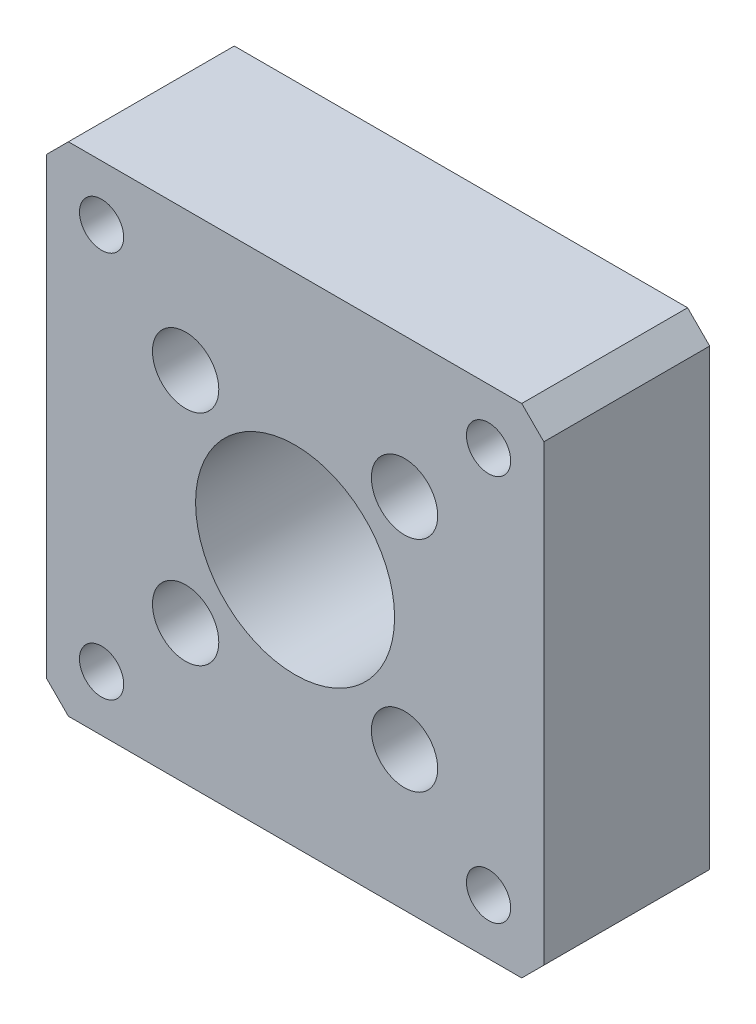
ISO-10303-21;
HEADER;
FILE_DESCRIPTION(('STEP AP214'),'2;1');
FILE_NAME('part.step','',(''),(''),'','','');
FILE_SCHEMA(('AUTOMOTIVE_DESIGN { 1 0 10303 214 1 1 1 1 }'));
ENDSEC;
DATA;
#1=APPLICATION_CONTEXT('core data for automotive mechanical design processes');
#2=APPLICATION_PROTOCOL_DEFINITION('international standard','automotive_design',2000,#1);
#3=PRODUCT_CONTEXT('',#1,'mechanical');
#4=PRODUCT('Part','Part','',(#3));
#5=PRODUCT_RELATED_PRODUCT_CATEGORY('part','',(#4));
#6=PRODUCT_DEFINITION_FORMATION('','',#4);
#7=PRODUCT_DEFINITION_CONTEXT('part definition',#1,'design');
#8=PRODUCT_DEFINITION('design','',#6,#7);
#9=PRODUCT_DEFINITION_SHAPE('','',#8);
#10=(LENGTH_UNIT() NAMED_UNIT(*) SI_UNIT(.MILLI.,.METRE.));
#11=(NAMED_UNIT(*) PLANE_ANGLE_UNIT() SI_UNIT($,.RADIAN.));
#12=(NAMED_UNIT(*) SI_UNIT($,.STERADIAN.) SOLID_ANGLE_UNIT());
#13=UNCERTAINTY_MEASURE_WITH_UNIT(LENGTH_MEASURE(1.E-05),#10,'distance_accuracy_value','');
#14=(GEOMETRIC_REPRESENTATION_CONTEXT(3) GLOBAL_UNCERTAINTY_ASSIGNED_CONTEXT((#13)) GLOBAL_UNIT_ASSIGNED_CONTEXT((#10,
#11,#12)) REPRESENTATION_CONTEXT('',''));
#15=CARTESIAN_POINT('',(0.,0.,0.));
#16=DIRECTION('',(0.,0.,1.));
#17=DIRECTION('',(1.,0.,0.));
#18=AXIS2_PLACEMENT_3D('',#15,#16,#17);
#19=CARTESIAN_POINT('',(0.,0.,11.2418833056655));
#20=DIRECTION('',(0.,0.,-1.));
#21=DIRECTION('',(-1.,0.,0.));
#22=AXIS2_PLACEMENT_3D('',#19,#20,#21);
#23=CYLINDRICAL_SURFACE('',#22,4.5);
#24=CARTESIAN_POINT('',(0.,0.,11.2418833056655));
#25=DIRECTION('',(0.,0.,1.));
#26=DIRECTION('',(1.,0.,0.));
#27=AXIS2_PLACEMENT_3D('',#24,#25,#26);
#28=CIRCLE('',#27,4.5);
#29=CARTESIAN_POINT('',(4.50000000000002,0.,11.2418833056655));
#30=VERTEX_POINT('',#29);
#31=EDGE_CURVE('E186',#30,#30,#28,.T.);
#32=ORIENTED_EDGE('',*,*,#31,.T.);
#33=EDGE_LOOP('',(#32));
#34=FACE_BOUND('',#33,.T.);
#35=CARTESIAN_POINT('',(0.,0.,4.74188330566552));
#36=DIRECTION('',(0.,0.,-1.));
#37=DIRECTION('',(-1.,0.,0.));
#38=AXIS2_PLACEMENT_3D('',#35,#36,#37);
#39=CIRCLE('',#38,4.5);
#40=CARTESIAN_POINT('',(-4.49999999999998,0.,4.74188330566552));
#41=VERTEX_POINT('',#40);
#42=EDGE_CURVE('E43',#41,#41,#39,.T.);
#43=ORIENTED_EDGE('',*,*,#42,.T.);
#44=EDGE_LOOP('',(#43));
#45=FACE_BOUND('',#44,.T.);
#46=ADVANCED_FACE('F39',(#34,#45),#23,.F.);
#47=CARTESIAN_POINT('',(4.94974746830584,4.94974746830584,1.40843092774945));
#48=DIRECTION('',(0.,0.,1.));
#49=DIRECTION('',(1.,0.,0.));
#50=AXIS2_PLACEMENT_3D('',#47,#48,#49);
#51=CYLINDRICAL_SURFACE('',#50,0.825);
#52=CARTESIAN_POINT('',(4.94974746830584,4.94974746830584,3.74188330566552));
#53=DIRECTION('',(0.,0.,1.));
#54=DIRECTION('',(1.,0.,0.));
#55=AXIS2_PLACEMENT_3D('',#52,#53,#54);
#56=CIRCLE('',#55,0.825);
#57=CARTESIAN_POINT('',(5.77474746830584,4.94974746830584,3.74188330566552));
#58=VERTEX_POINT('',#57);
#59=EDGE_CURVE('E218',#58,#58,#56,.F.);
#60=ORIENTED_EDGE('',*,*,#59,.T.);
#61=EDGE_LOOP('',(#60));
#62=FACE_BOUND('',#61,.T.);
#63=CARTESIAN_POINT('',(4.94974746830584,4.94974746830584,7.24188330566553));
#64=DIRECTION('',(0.,0.,1.));
#65=DIRECTION('',(1.,0.,0.));
#66=AXIS2_PLACEMENT_3D('',#63,#64,#65);
#67=CIRCLE('',#66,0.825);
#68=CARTESIAN_POINT('',(5.77474746830584,4.94974746830584,7.24188330566553));
#69=VERTEX_POINT('',#68);
#70=EDGE_CURVE('E152',#69,#69,#67,.F.);
#71=ORIENTED_EDGE('',*,*,#70,.F.);
#72=EDGE_LOOP('',(#71));
#73=FACE_BOUND('',#72,.T.);
#74=ADVANCED_FACE('F275',(#62,#73),#51,.F.);
#75=CARTESIAN_POINT('',(4.94974746830585,-4.94974746830584,1.40843092774945));
#76=DIRECTION('',(0.,0.,1.));
#77=DIRECTION('',(1.,0.,0.));
#78=AXIS2_PLACEMENT_3D('',#75,#76,#77);
#79=CYLINDRICAL_SURFACE('',#78,0.825);
#80=CARTESIAN_POINT('',(4.94974746830585,-4.94974746830584,3.74188330566552));
#81=DIRECTION('',(0.,0.,1.));
#82=DIRECTION('',(1.,0.,0.));
#83=AXIS2_PLACEMENT_3D('',#80,#81,#82);
#84=CIRCLE('',#83,0.825);
#85=CARTESIAN_POINT('',(5.77474746830585,-4.94974746830584,3.74188330566552));
#86=VERTEX_POINT('',#85);
#87=EDGE_CURVE('E223',#86,#86,#84,.F.);
#88=ORIENTED_EDGE('',*,*,#87,.T.);
#89=EDGE_LOOP('',(#88));
#90=FACE_BOUND('',#89,.T.);
#91=CARTESIAN_POINT('',(4.94974746830585,-4.94974746830584,7.24188330566553));
#92=DIRECTION('',(0.,0.,1.));
#93=DIRECTION('',(1.,0.,0.));
#94=AXIS2_PLACEMENT_3D('',#91,#92,#93);
#95=CIRCLE('',#94,0.825);
#96=CARTESIAN_POINT('',(5.77474746830585,-4.94974746830584,7.24188330566553));
#97=VERTEX_POINT('',#96);
#98=EDGE_CURVE('E149',#97,#97,#95,.F.);
#99=ORIENTED_EDGE('',*,*,#98,.F.);
#100=EDGE_LOOP('',(#99));
#101=FACE_BOUND('',#100,.T.);
#102=ADVANCED_FACE('F281',(#90,#101),#79,.F.);
#103=CARTESIAN_POINT('',(-4.94974746830566,-4.94974746830598,1.40843092774945));
#104=DIRECTION('',(0.,0.,1.));
#105=DIRECTION('',(1.,0.,0.));
#106=AXIS2_PLACEMENT_3D('',#103,#104,#105);
#107=CYLINDRICAL_SURFACE('',#106,0.825000000000115);
#108=CARTESIAN_POINT('',(-4.94974746830566,-4.94974746830598,3.74188330566552));
#109=DIRECTION('',(0.,0.,1.));
#110=DIRECTION('',(1.,0.,0.));
#111=AXIS2_PLACEMENT_3D('',#108,#109,#110);
#112=CIRCLE('',#111,0.825000000000115);
#113=CARTESIAN_POINT('',(-4.12474746830555,-4.94974746830598,3.74188330566552));
#114=VERTEX_POINT('',#113);
#115=EDGE_CURVE('E226',#114,#114,#112,.F.);
#116=ORIENTED_EDGE('',*,*,#115,.T.);
#117=EDGE_LOOP('',(#116));
#118=FACE_BOUND('',#117,.T.);
#119=CARTESIAN_POINT('',(-4.94974746830566,-4.94974746830598,7.24188330566553));
#120=DIRECTION('',(0.,0.,1.));
#121=DIRECTION('',(1.,0.,0.));
#122=AXIS2_PLACEMENT_3D('',#119,#120,#121);
#123=CIRCLE('',#122,0.825000000000115);
#124=CARTESIAN_POINT('',(-4.12474746830555,-4.94974746830598,7.24188330566553));
#125=VERTEX_POINT('',#124);
#126=EDGE_CURVE('E145',#125,#125,#123,.F.);
#127=ORIENTED_EDGE('',*,*,#126,.F.);
#128=EDGE_LOOP('',(#127));
#129=FACE_BOUND('',#128,.T.);
#130=ADVANCED_FACE('F397',(#118,#129),#107,.F.);
#131=CARTESIAN_POINT('',(-4.94974746830582,4.94974746830568,1.40843092774945));
#132=DIRECTION('',(0.,0.,1.));
#133=DIRECTION('',(1.,0.,0.));
#134=AXIS2_PLACEMENT_3D('',#131,#132,#133);
#135=CYLINDRICAL_SURFACE('',#134,0.825000000000167);
#136=CARTESIAN_POINT('',(-4.94974746830582,4.94974746830568,3.74188330566552));
#137=DIRECTION('',(0.,0.,1.));
#138=DIRECTION('',(1.,0.,0.));
#139=AXIS2_PLACEMENT_3D('',#136,#137,#138);
#140=CIRCLE('',#139,0.825000000000167);
#141=CARTESIAN_POINT('',(-4.12474746830566,4.94974746830568,3.74188330566552));
#142=VERTEX_POINT('',#141);
#143=EDGE_CURVE('E155',#142,#142,#140,.F.);
#144=ORIENTED_EDGE('',*,*,#143,.T.);
#145=EDGE_LOOP('',(#144));
#146=FACE_BOUND('',#145,.T.);
#147=CARTESIAN_POINT('',(-4.94974746830582,4.94974746830568,7.24188330566553));
#148=DIRECTION('',(0.,0.,1.));
#149=DIRECTION('',(1.,0.,0.));
#150=AXIS2_PLACEMENT_3D('',#147,#148,#149);
#151=CIRCLE('',#150,0.825000000000167);
#152=CARTESIAN_POINT('',(-4.12474746830566,4.94974746830568,7.24188330566553));
#153=VERTEX_POINT('',#152);
#154=EDGE_CURVE('E142',#153,#153,#151,.F.);
#155=ORIENTED_EDGE('',*,*,#154,.F.);
#156=EDGE_LOOP('',(#155));
#157=FACE_BOUND('',#156,.T.);
#158=ADVANCED_FACE('F291',(#146,#157),#135,.F.);
#159=CARTESIAN_POINT('',(0.,0.,11.2418833056655));
#160=DIRECTION('',(0.,0.,1.));
#161=DIRECTION('',(1.,0.,0.));
#162=AXIS2_PLACEMENT_3D('',#159,#160,#161);
#163=PLANE('',#162);
#164=CARTESIAN_POINT('',(-4.94974746830582,4.94974746830568,11.2418833056655));
#165=DIRECTION('',(0.,0.,1.));
#166=DIRECTION('',(1.,0.,0.));
#167=AXIS2_PLACEMENT_3D('',#164,#165,#166);
#168=CIRCLE('',#167,1.50000000000017);
#169=CARTESIAN_POINT('',(-3.44974746830566,4.94974746830568,11.2418833056655));
#170=VERTEX_POINT('',#169);
#171=EDGE_CURVE('E241',#170,#170,#168,.T.);
#172=ORIENTED_EDGE('',*,*,#171,.F.);
#173=EDGE_LOOP('',(#172));
#174=FACE_BOUND('',#173,.T.);
#175=CARTESIAN_POINT('',(-4.94974746830566,-4.94974746830598,11.2418833056655));
#176=DIRECTION('',(0.,0.,1.));
#177=DIRECTION('',(1.,0.,0.));
#178=AXIS2_PLACEMENT_3D('',#175,#176,#177);
#179=CIRCLE('',#178,1.50000000000011);
#180=CARTESIAN_POINT('',(-3.44974746830555,-4.94974746830598,11.2418833056655));
#181=VERTEX_POINT('',#180);
#182=EDGE_CURVE('E240',#181,#181,#179,.T.);
#183=ORIENTED_EDGE('',*,*,#182,.F.);
#184=EDGE_LOOP('',(#183));
#185=FACE_BOUND('',#184,.T.);
#186=CARTESIAN_POINT('',(4.949747468306,-4.94974746830583,11.2418833056655));
#187=DIRECTION('',(0.,0.,1.));
#188=DIRECTION('',(1.,0.,0.));
#189=AXIS2_PLACEMENT_3D('',#186,#187,#188);
#190=CIRCLE('',#189,1.49999999999997);
#191=CARTESIAN_POINT('',(6.44974746830597,-4.94974746830583,11.2418833056655));
#192=VERTEX_POINT('',#191);
#193=EDGE_CURVE('E247',#192,#192,#190,.T.);
#194=ORIENTED_EDGE('',*,*,#193,.F.);
#195=EDGE_LOOP('',(#194));
#196=FACE_BOUND('',#195,.T.);
#197=CARTESIAN_POINT('',(4.94974746830584,4.94974746830584,11.2418833056655));
#198=DIRECTION('',(0.,0.,1.));
#199=DIRECTION('',(1.,0.,0.));
#200=AXIS2_PLACEMENT_3D('',#197,#198,#199);
#201=CIRCLE('',#200,1.5);
#202=CARTESIAN_POINT('',(6.44974746830584,4.94974746830584,11.2418833056655));
#203=VERTEX_POINT('',#202);
#204=EDGE_CURVE('E233',#203,#203,#201,.T.);
#205=ORIENTED_EDGE('',*,*,#204,.F.);
#206=EDGE_LOOP('',(#205));
#207=FACE_BOUND('',#206,.T.);
#208=CARTESIAN_POINT('',(8.74999999999998,-8.75000000000002,11.2418833056655));
#209=DIRECTION('',(0.,0.,1.));
#210=DIRECTION('',(1.,0.,0.));
#211=AXIS2_PLACEMENT_3D('',#208,#209,#210);
#212=CIRCLE('',#211,1.);
#213=CARTESIAN_POINT('',(9.74999999999998,-8.75000000000002,11.2418833056655));
#214=VERTEX_POINT('',#213);
#215=EDGE_CURVE('E206',#214,#214,#212,.T.);
#216=ORIENTED_EDGE('',*,*,#215,.F.);
#217=EDGE_LOOP('',(#216));
#218=FACE_BOUND('',#217,.T.);
#219=CARTESIAN_POINT('',(-8.75000000000002,8.74999999999998,11.2418833056655));
#220=DIRECTION('',(0.,0.,1.));
#221=DIRECTION('',(1.,0.,0.));
#222=AXIS2_PLACEMENT_3D('',#219,#220,#221);
#223=CIRCLE('',#222,1.);
#224=CARTESIAN_POINT('',(-7.75000000000002,8.74999999999998,11.2418833056655));
#225=VERTEX_POINT('',#224);
#226=EDGE_CURVE('E189',#225,#225,#223,.T.);
#227=ORIENTED_EDGE('',*,*,#226,.F.);
#228=EDGE_LOOP('',(#227));
#229=FACE_BOUND('',#228,.T.);
#230=DIRECTION('',(0.,-1.,0.));
#231=VECTOR('',#230,1.);
#232=CARTESIAN_POINT('',(-11.25,11.25,11.2418833056655));
#233=LINE('',#232,#231);
#234=CARTESIAN_POINT('',(-11.25,10.25,11.2418833056655));
#235=VERTEX_POINT('',#234);
#236=CARTESIAN_POINT('',(-11.25,-10.25,11.2418833056655));
#237=VERTEX_POINT('',#236);
#238=EDGE_CURVE('E193',#235,#237,#233,.T.);
#239=ORIENTED_EDGE('',*,*,#238,.T.);
#240=DIRECTION('',(-0.707106781186545,0.70710678118655,0.));
#241=VECTOR('',#240,1.);
#242=CARTESIAN_POINT('',(-10.75,-10.75,11.2418833056655));
#243=LINE('',#242,#241);
#244=CARTESIAN_POINT('',(-10.25,-11.25,11.2418833056655));
#245=VERTEX_POINT('',#244);
#246=EDGE_CURVE('E169',#237,#245,#243,.F.);
#247=ORIENTED_EDGE('',*,*,#246,.T.);
#248=DIRECTION('',(1.,0.,0.));
#249=VECTOR('',#248,1.);
#250=CARTESIAN_POINT('',(-11.25,-11.25,11.2418833056655));
#251=LINE('',#250,#249);
#252=CARTESIAN_POINT('',(10.25,-11.25,11.2418833056655));
#253=VERTEX_POINT('',#252);
#254=EDGE_CURVE('E126',#245,#253,#251,.T.);
#255=ORIENTED_EDGE('',*,*,#254,.T.);
#256=DIRECTION('',(-0.707106781186549,-0.707106781186546,0.));
#257=VECTOR('',#256,1.);
#258=CARTESIAN_POINT('',(10.75,-10.75,11.2418833056655));
#259=LINE('',#258,#257);
#260=CARTESIAN_POINT('',(11.25,-10.25,11.2418833056655));
#261=VERTEX_POINT('',#260);
#262=EDGE_CURVE('E167',#253,#261,#259,.F.);
#263=ORIENTED_EDGE('',*,*,#262,.T.);
#264=DIRECTION('',(0.,1.,0.));
#265=VECTOR('',#264,1.);
#266=CARTESIAN_POINT('',(11.25,11.25,11.2418833056655));
#267=LINE('',#266,#265);
#268=CARTESIAN_POINT('',(11.25,10.25,11.2418833056655));
#269=VERTEX_POINT('',#268);
#270=EDGE_CURVE('E133',#261,#269,#267,.T.);
#271=ORIENTED_EDGE('',*,*,#270,.T.);
#272=DIRECTION('',(0.707106781186548,-0.707106781186548,0.));
#273=VECTOR('',#272,1.);
#274=CARTESIAN_POINT('',(10.75,10.75,11.2418833056655));
#275=LINE('',#274,#273);
#276=CARTESIAN_POINT('',(10.25,11.25,11.2418833056655));
#277=VERTEX_POINT('',#276);
#278=EDGE_CURVE('E61',#269,#277,#275,.F.);
#279=ORIENTED_EDGE('',*,*,#278,.T.);
#280=DIRECTION('',(-1.,0.,0.));
#281=VECTOR('',#280,1.);
#282=CARTESIAN_POINT('',(-11.25,11.25,11.2418833056655));
#283=LINE('',#282,#281);
#284=CARTESIAN_POINT('',(-10.25,11.25,11.2418833056655));
#285=VERTEX_POINT('',#284);
#286=EDGE_CURVE('E136',#277,#285,#283,.T.);
#287=ORIENTED_EDGE('',*,*,#286,.T.);
#288=DIRECTION('',(0.707106781186549,0.707106781186546,0.));
#289=VECTOR('',#288,1.);
#290=CARTESIAN_POINT('',(-10.75,10.75,11.2418833056655));
#291=LINE('',#290,#289);
#292=EDGE_CURVE('E164',#285,#235,#291,.F.);
#293=ORIENTED_EDGE('',*,*,#292,.T.);
#294=EDGE_LOOP('',(#239,#247,#255,#263,#271,#279,#287,#293));
#295=FACE_BOUND('',#294,.T.);
#296=ORIENTED_EDGE('',*,*,#31,.F.);
#297=EDGE_LOOP('',(#296));
#298=FACE_BOUND('',#297,.T.);
#299=CARTESIAN_POINT('',(8.74999999999999,8.74999999999998,11.2418833056655));
#300=DIRECTION('',(0.,0.,1.));
#301=DIRECTION('',(1.,0.,0.));
#302=AXIS2_PLACEMENT_3D('',#299,#300,#301);
#303=CIRCLE('',#302,0.999999999999999);
#304=CARTESIAN_POINT('',(9.74999999999998,8.74999999999998,11.2418833056655));
#305=VERTEX_POINT('',#304);
#306=EDGE_CURVE('E200',#305,#305,#303,.T.);
#307=ORIENTED_EDGE('',*,*,#306,.F.);
#308=EDGE_LOOP('',(#307));
#309=FACE_BOUND('',#308,.T.);
#310=CARTESIAN_POINT('',(-8.75000000000002,-8.75000000000002,11.2418833056655));
#311=DIRECTION('',(0.,0.,1.));
#312=DIRECTION('',(1.,0.,0.));
#313=AXIS2_PLACEMENT_3D('',#310,#311,#312);
#314=CIRCLE('',#313,1.);
#315=CARTESIAN_POINT('',(-7.75000000000002,-8.75000000000002,11.2418833056655));
#316=VERTEX_POINT('',#315);
#317=EDGE_CURVE('E212',#316,#316,#314,.T.);
#318=ORIENTED_EDGE('',*,*,#317,.F.);
#319=EDGE_LOOP('',(#318));
#320=FACE_BOUND('',#319,.T.);
#321=ADVANCED_FACE('F288',(#174,#185,#196,#207,#218,#229,#295,#298,#309,#320),#163,.T.);
#322=CARTESIAN_POINT('',(0.,0.,3.74188330566552));
#323=DIRECTION('',(0.,0.,1.));
#324=DIRECTION('',(1.,0.,0.));
#325=AXIS2_PLACEMENT_3D('',#322,#323,#324);
#326=PLANE('',#325);
#327=CARTESIAN_POINT('',(0.,0.,3.74188330566552));
#328=DIRECTION('',(0.,0.,-1.));
#329=DIRECTION('',(-1.,0.,0.));
#330=AXIS2_PLACEMENT_3D('',#327,#328,#329);
#331=CIRCLE('',#330,5.6);
#332=CARTESIAN_POINT('',(-5.59999999999998,0.,3.74188330566552));
#333=VERTEX_POINT('',#332);
#334=EDGE_CURVE('E254',#333,#333,#331,.T.);
#335=ORIENTED_EDGE('',*,*,#334,.F.);
#336=EDGE_LOOP('',(#335));
#337=FACE_BOUND('',#336,.T.);
#338=ORIENTED_EDGE('',*,*,#143,.F.);
#339=EDGE_LOOP('',(#338));
#340=FACE_BOUND('',#339,.T.);
#341=ORIENTED_EDGE('',*,*,#115,.F.);
#342=EDGE_LOOP('',(#341));
#343=FACE_BOUND('',#342,.T.);
#344=ORIENTED_EDGE('',*,*,#87,.F.);
#345=EDGE_LOOP('',(#344));
#346=FACE_BOUND('',#345,.T.);
#347=ORIENTED_EDGE('',*,*,#59,.F.);
#348=EDGE_LOOP('',(#347));
#349=FACE_BOUND('',#348,.T.);
#350=DIRECTION('',(1.,0.,0.));
#351=VECTOR('',#350,1.);
#352=CARTESIAN_POINT('',(-11.25,-11.25,3.74188330566552));
#353=LINE('',#352,#351);
#354=CARTESIAN_POINT('',(-10.25,-11.25,3.74188330566552));
#355=VERTEX_POINT('',#354);
#356=CARTESIAN_POINT('',(10.25,-11.25,3.74188330566552));
#357=VERTEX_POINT('',#356);
#358=EDGE_CURVE('E123',#355,#357,#353,.T.);
#359=ORIENTED_EDGE('',*,*,#358,.F.);
#360=DIRECTION('',(0.707106781186545,-0.70710678118655,0.));
#361=VECTOR('',#360,1.);
#362=CARTESIAN_POINT('',(-10.25,-11.25,3.74188330566552));
#363=LINE('',#362,#361);
#364=CARTESIAN_POINT('',(-11.25,-10.25,3.74188330566552));
#365=VERTEX_POINT('',#364);
#366=EDGE_CURVE('E106',#355,#365,#363,.F.);
#367=ORIENTED_EDGE('',*,*,#366,.T.);
#368=DIRECTION('',(0.,-1.,0.));
#369=VECTOR('',#368,1.);
#370=CARTESIAN_POINT('',(-11.25,11.25,3.74188330566552));
#371=LINE('',#370,#369);
#372=CARTESIAN_POINT('',(-11.25,10.25,3.74188330566552));
#373=VERTEX_POINT('',#372);
#374=EDGE_CURVE('E134',#373,#365,#371,.T.);
#375=ORIENTED_EDGE('',*,*,#374,.F.);
#376=DIRECTION('',(-0.707106781186549,-0.707106781186546,0.));
#377=VECTOR('',#376,1.);
#378=CARTESIAN_POINT('',(-11.25,10.25,3.74188330566552));
#379=LINE('',#378,#377);
#380=CARTESIAN_POINT('',(-10.25,11.25,3.74188330566552));
#381=VERTEX_POINT('',#380);
#382=EDGE_CURVE('E127',#373,#381,#379,.F.);
#383=ORIENTED_EDGE('',*,*,#382,.T.);
#384=DIRECTION('',(-1.,0.,0.));
#385=VECTOR('',#384,1.);
#386=CARTESIAN_POINT('',(-11.25,11.25,3.74188330566552));
#387=LINE('',#386,#385);
#388=CARTESIAN_POINT('',(10.25,11.25,3.74188330566552));
#389=VERTEX_POINT('',#388);
#390=EDGE_CURVE('E138',#389,#381,#387,.T.);
#391=ORIENTED_EDGE('',*,*,#390,.F.);
#392=DIRECTION('',(-0.707106781186548,0.707106781186548,0.));
#393=VECTOR('',#392,1.);
#394=CARTESIAN_POINT('',(10.25,11.25,3.74188330566552));
#395=LINE('',#394,#393);
#396=CARTESIAN_POINT('',(11.25,10.25,3.74188330566552));
#397=VERTEX_POINT('',#396);
#398=EDGE_CURVE('E158',#389,#397,#395,.F.);
#399=ORIENTED_EDGE('',*,*,#398,.T.);
#400=DIRECTION('',(0.,1.,0.));
#401=VECTOR('',#400,1.);
#402=CARTESIAN_POINT('',(11.25,11.25,3.74188330566552));
#403=LINE('',#402,#401);
#404=CARTESIAN_POINT('',(11.25,-10.25,3.74188330566552));
#405=VERTEX_POINT('',#404);
#406=EDGE_CURVE('E181',#405,#397,#403,.T.);
#407=ORIENTED_EDGE('',*,*,#406,.F.);
#408=DIRECTION('',(0.707106781186549,0.707106781186546,0.));
#409=VECTOR('',#408,1.);
#410=CARTESIAN_POINT('',(11.25,-10.25,3.74188330566552));
#411=LINE('',#410,#409);
#412=EDGE_CURVE('E117',#405,#357,#411,.F.);
#413=ORIENTED_EDGE('',*,*,#412,.T.);
#414=EDGE_LOOP('',(#359,#367,#375,#383,#391,#399,#407,#413));
#415=FACE_BOUND('',#414,.T.);
#416=CARTESIAN_POINT('',(-8.75000000000002,8.74999999999998,3.74188330566552));
#417=DIRECTION('',(0.,0.,1.));
#418=DIRECTION('',(1.,0.,0.));
#419=AXIS2_PLACEMENT_3D('',#416,#417,#418);
#420=CIRCLE('',#419,1.);
#421=CARTESIAN_POINT('',(-7.75000000000002,8.74999999999998,3.74188330566552));
#422=VERTEX_POINT('',#421);
#423=EDGE_CURVE('E197',#422,#422,#420,.T.);
#424=ORIENTED_EDGE('',*,*,#423,.T.);
#425=EDGE_LOOP('',(#424));
#426=FACE_BOUND('',#425,.T.);
#427=CARTESIAN_POINT('',(8.74999999999999,8.74999999999998,3.74188330566552));
#428=DIRECTION('',(0.,0.,1.));
#429=DIRECTION('',(1.,0.,0.));
#430=AXIS2_PLACEMENT_3D('',#427,#428,#429);
#431=CIRCLE('',#430,0.999999999999999);
#432=CARTESIAN_POINT('',(9.74999999999998,8.74999999999998,3.74188330566552));
#433=VERTEX_POINT('',#432);
#434=EDGE_CURVE('E203',#433,#433,#431,.T.);
#435=ORIENTED_EDGE('',*,*,#434,.T.);
#436=EDGE_LOOP('',(#435));
#437=FACE_BOUND('',#436,.T.);
#438=CARTESIAN_POINT('',(8.74999999999998,-8.75000000000002,3.74188330566552));
#439=DIRECTION('',(0.,0.,1.));
#440=DIRECTION('',(1.,0.,0.));
#441=AXIS2_PLACEMENT_3D('',#438,#439,#440);
#442=CIRCLE('',#441,1.);
#443=CARTESIAN_POINT('',(9.74999999999998,-8.75000000000002,3.74188330566552));
#444=VERTEX_POINT('',#443);
#445=EDGE_CURVE('E209',#444,#444,#442,.T.);
#446=ORIENTED_EDGE('',*,*,#445,.T.);
#447=EDGE_LOOP('',(#446));
#448=FACE_BOUND('',#447,.T.);
#449=CARTESIAN_POINT('',(-8.75000000000002,-8.75000000000002,3.74188330566552));
#450=DIRECTION('',(0.,0.,1.));
#451=DIRECTION('',(1.,0.,0.));
#452=AXIS2_PLACEMENT_3D('',#449,#450,#451);
#453=CIRCLE('',#452,1.);
#454=CARTESIAN_POINT('',(-7.75000000000002,-8.75000000000002,3.74188330566552));
#455=VERTEX_POINT('',#454);
#456=EDGE_CURVE('E215',#455,#455,#453,.T.);
#457=ORIENTED_EDGE('',*,*,#456,.T.);
#458=EDGE_LOOP('',(#457));
#459=FACE_BOUND('',#458,.T.);
#460=ADVANCED_FACE('F130',(#337,#340,#343,#346,#349,#415,#426,#437,#448,#459),#326,.F.);
#461=CARTESIAN_POINT('',(11.25,11.25,11.2418833056655));
#462=DIRECTION('',(-1.,0.,0.));
#463=DIRECTION('',(0.,0.,1.));
#464=AXIS2_PLACEMENT_3D('',#461,#462,#463);
#465=PLANE('',#464);
#466=ORIENTED_EDGE('',*,*,#270,.F.);
#467=DIRECTION('',(0.,0.,-1.));
#468=VECTOR('',#467,1.);
#469=CARTESIAN_POINT('',(11.25,-10.25,11.2418833056655));
#470=LINE('',#469,#468);
#471=EDGE_CURVE('E173',#261,#405,#470,.T.);
#472=ORIENTED_EDGE('',*,*,#471,.T.);
#473=ORIENTED_EDGE('',*,*,#406,.T.);
#474=DIRECTION('',(0.,0.,1.));
#475=VECTOR('',#474,1.);
#476=CARTESIAN_POINT('',(11.25,10.25,11.2418833056655));
#477=LINE('',#476,#475);
#478=EDGE_CURVE('E171',#397,#269,#477,.T.);
#479=ORIENTED_EDGE('',*,*,#478,.T.);
#480=EDGE_LOOP('',(#466,#472,#473,#479));
#481=FACE_BOUND('',#480,.T.);
#482=ADVANCED_FACE('F180',(#481),#465,.F.);
#483=CARTESIAN_POINT('',(-11.25,11.25,11.2418833056655));
#484=DIRECTION('',(0.,-1.,0.));
#485=DIRECTION('',(0.,0.,-1.));
#486=AXIS2_PLACEMENT_3D('',#483,#484,#485);
#487=PLANE('',#486);
#488=ORIENTED_EDGE('',*,*,#286,.F.);
#489=DIRECTION('',(0.,0.,-1.));
#490=VECTOR('',#489,1.);
#491=CARTESIAN_POINT('',(10.25,11.25,11.2418833056655));
#492=LINE('',#491,#490);
#493=EDGE_CURVE('E12',#277,#389,#492,.T.);
#494=ORIENTED_EDGE('',*,*,#493,.T.);
#495=ORIENTED_EDGE('',*,*,#390,.T.);
#496=DIRECTION('',(0.,0.,1.));
#497=VECTOR('',#496,1.);
#498=CARTESIAN_POINT('',(-10.25,11.25,11.2418833056655));
#499=LINE('',#498,#497);
#500=EDGE_CURVE('E48',#381,#285,#499,.T.);
#501=ORIENTED_EDGE('',*,*,#500,.T.);
#502=EDGE_LOOP('',(#488,#494,#495,#501));
#503=FACE_BOUND('',#502,.T.);
#504=ADVANCED_FACE('F301',(#503),#487,.F.);
#505=CARTESIAN_POINT('',(-11.25,11.25,11.2418833056655));
#506=DIRECTION('',(1.,0.,0.));
#507=DIRECTION('',(0.,1.,0.));
#508=AXIS2_PLACEMENT_3D('',#505,#506,#507);
#509=PLANE('',#508);
#510=ORIENTED_EDGE('',*,*,#374,.T.);
#511=DIRECTION('',(0.,0.,1.));
#512=VECTOR('',#511,1.);
#513=CARTESIAN_POINT('',(-11.25,-10.25,11.2418833056655));
#514=LINE('',#513,#512);
#515=EDGE_CURVE('E111',#365,#237,#514,.T.);
#516=ORIENTED_EDGE('',*,*,#515,.T.);
#517=ORIENTED_EDGE('',*,*,#238,.F.);
#518=DIRECTION('',(0.,0.,-1.));
#519=VECTOR('',#518,1.);
#520=CARTESIAN_POINT('',(-11.25,10.25,11.2418833056655));
#521=LINE('',#520,#519);
#522=EDGE_CURVE('E116',#235,#373,#521,.T.);
#523=ORIENTED_EDGE('',*,*,#522,.T.);
#524=EDGE_LOOP('',(#510,#516,#517,#523));
#525=FACE_BOUND('',#524,.T.);
#526=ADVANCED_FACE('F298',(#525),#509,.F.);
#527=CARTESIAN_POINT('',(-11.25,-11.25,11.2418833056655));
#528=DIRECTION('',(0.,1.,0.));
#529=DIRECTION('',(0.,0.,1.));
#530=AXIS2_PLACEMENT_3D('',#527,#528,#529);
#531=PLANE('',#530);
#532=ORIENTED_EDGE('',*,*,#254,.F.);
#533=DIRECTION('',(0.,0.,-1.));
#534=VECTOR('',#533,1.);
#535=CARTESIAN_POINT('',(-10.25,-11.25,11.2418833056655));
#536=LINE('',#535,#534);
#537=EDGE_CURVE('E110',#245,#355,#536,.T.);
#538=ORIENTED_EDGE('',*,*,#537,.T.);
#539=ORIENTED_EDGE('',*,*,#358,.T.);
#540=DIRECTION('',(0.,0.,1.));
#541=VECTOR('',#540,1.);
#542=CARTESIAN_POINT('',(10.25,-11.25,11.2418833056655));
#543=LINE('',#542,#541);
#544=EDGE_CURVE('E128',#357,#253,#543,.T.);
#545=ORIENTED_EDGE('',*,*,#544,.T.);
#546=EDGE_LOOP('',(#532,#538,#539,#545));
#547=FACE_BOUND('',#546,.T.);
#548=ADVANCED_FACE('F122',(#547),#531,.F.);
#549=CARTESIAN_POINT('',(-8.75000000000002,8.74999999999998,11.2418833056655));
#550=DIRECTION('',(0.,0.,-1.));
#551=DIRECTION('',(-1.,0.,0.));
#552=AXIS2_PLACEMENT_3D('',#549,#550,#551);
#553=CYLINDRICAL_SURFACE('',#552,1.);
#554=ORIENTED_EDGE('',*,*,#226,.T.);
#555=EDGE_LOOP('',(#554));
#556=FACE_BOUND('',#555,.T.);
#557=ORIENTED_EDGE('',*,*,#423,.F.);
#558=EDGE_LOOP('',(#557));
#559=FACE_BOUND('',#558,.T.);
#560=ADVANCED_FACE('F286',(#556,#559),#553,.F.);
#561=CARTESIAN_POINT('',(8.74999999999999,8.74999999999998,11.2418833056655));
#562=DIRECTION('',(0.,0.,-1.));
#563=DIRECTION('',(-1.,0.,0.));
#564=AXIS2_PLACEMENT_3D('',#561,#562,#563);
#565=CYLINDRICAL_SURFACE('',#564,0.999999999999999);
#566=ORIENTED_EDGE('',*,*,#306,.T.);
#567=EDGE_LOOP('',(#566));
#568=FACE_BOUND('',#567,.T.);
#569=ORIENTED_EDGE('',*,*,#434,.F.);
#570=EDGE_LOOP('',(#569));
#571=FACE_BOUND('',#570,.T.);
#572=ADVANCED_FACE('F345',(#568,#571),#565,.F.);
#573=CARTESIAN_POINT('',(8.74999999999998,-8.75000000000002,11.2418833056655));
#574=DIRECTION('',(0.,0.,-1.));
#575=DIRECTION('',(-1.,0.,0.));
#576=AXIS2_PLACEMENT_3D('',#573,#574,#575);
#577=CYLINDRICAL_SURFACE('',#576,1.);
#578=ORIENTED_EDGE('',*,*,#215,.T.);
#579=EDGE_LOOP('',(#578));
#580=FACE_BOUND('',#579,.T.);
#581=ORIENTED_EDGE('',*,*,#445,.F.);
#582=EDGE_LOOP('',(#581));
#583=FACE_BOUND('',#582,.T.);
#584=ADVANCED_FACE('F334',(#580,#583),#577,.F.);
#585=CARTESIAN_POINT('',(-8.75000000000002,-8.75000000000002,11.2418833056655));
#586=DIRECTION('',(0.,0.,-1.));
#587=DIRECTION('',(-1.,0.,0.));
#588=AXIS2_PLACEMENT_3D('',#585,#586,#587);
#589=CYLINDRICAL_SURFACE('',#588,1.);
#590=ORIENTED_EDGE('',*,*,#317,.T.);
#591=EDGE_LOOP('',(#590));
#592=FACE_BOUND('',#591,.T.);
#593=ORIENTED_EDGE('',*,*,#456,.F.);
#594=EDGE_LOOP('',(#593));
#595=FACE_BOUND('',#594,.T.);
#596=ADVANCED_FACE('F330',(#592,#595),#589,.F.);
#597=CARTESIAN_POINT('',(0.,0.,7.24188330566553));
#598=DIRECTION('',(0.,0.,1.));
#599=DIRECTION('',(1.,0.,0.));
#600=AXIS2_PLACEMENT_3D('',#597,#598,#599);
#601=PLANE('',#600);
#602=CARTESIAN_POINT('',(-4.94974746830582,4.94974746830568,7.24188330566553));
#603=DIRECTION('',(0.,0.,1.));
#604=DIRECTION('',(1.,0.,0.));
#605=AXIS2_PLACEMENT_3D('',#602,#603,#604);
#606=CIRCLE('',#605,1.50000000000017);
#607=CARTESIAN_POINT('',(-3.44974746830566,4.94974746830568,7.24188330566553));
#608=VERTEX_POINT('',#607);
#609=EDGE_CURVE('E237',#608,#608,#606,.F.);
#610=ORIENTED_EDGE('',*,*,#609,.F.);
#611=EDGE_LOOP('',(#610));
#612=FACE_BOUND('',#611,.T.);
#613=ORIENTED_EDGE('',*,*,#154,.T.);
#614=EDGE_LOOP('',(#613));
#615=FACE_BOUND('',#614,.T.);
#616=ADVANCED_FACE('F333',(#612,#615),#601,.T.);
#617=CARTESIAN_POINT('',(-4.94974746830582,4.94974746830568,-0.50075738145423));
#618=DIRECTION('',(0.,0.,1.));
#619=DIRECTION('',(1.,0.,0.));
#620=AXIS2_PLACEMENT_3D('',#617,#618,#619);
#621=CYLINDRICAL_SURFACE('',#620,1.50000000000017);
#622=ORIENTED_EDGE('',*,*,#609,.T.);
#623=EDGE_LOOP('',(#622));
#624=FACE_BOUND('',#623,.T.);
#625=ORIENTED_EDGE('',*,*,#171,.T.);
#626=EDGE_LOOP('',(#625));
#627=FACE_BOUND('',#626,.T.);
#628=ADVANCED_FACE('F342',(#624,#627),#621,.F.);
#629=CARTESIAN_POINT('',(0.,0.,7.24188330566553));
#630=DIRECTION('',(0.,0.,1.));
#631=DIRECTION('',(1.,0.,0.));
#632=AXIS2_PLACEMENT_3D('',#629,#630,#631);
#633=PLANE('',#632);
#634=CARTESIAN_POINT('',(-4.94974746830566,-4.94974746830598,7.24188330566553));
#635=DIRECTION('',(0.,0.,1.));
#636=DIRECTION('',(1.,0.,0.));
#637=AXIS2_PLACEMENT_3D('',#634,#635,#636);
#638=CIRCLE('',#637,1.50000000000011);
#639=CARTESIAN_POINT('',(-3.44974746830555,-4.94974746830598,7.24188330566553));
#640=VERTEX_POINT('',#639);
#641=EDGE_CURVE('E244',#640,#640,#638,.F.);
#642=ORIENTED_EDGE('',*,*,#641,.F.);
#643=EDGE_LOOP('',(#642));
#644=FACE_BOUND('',#643,.T.);
#645=ORIENTED_EDGE('',*,*,#126,.T.);
#646=EDGE_LOOP('',(#645));
#647=FACE_BOUND('',#646,.T.);
#648=ADVANCED_FACE('F502',(#644,#647),#633,.T.);
#649=CARTESIAN_POINT('',(-4.94974746830566,-4.94974746830598,-0.50075738145423));
#650=DIRECTION('',(0.,0.,1.));
#651=DIRECTION('',(1.,0.,0.));
#652=AXIS2_PLACEMENT_3D('',#649,#650,#651);
#653=CYLINDRICAL_SURFACE('',#652,1.50000000000011);
#654=ORIENTED_EDGE('',*,*,#641,.T.);
#655=EDGE_LOOP('',(#654));
#656=FACE_BOUND('',#655,.T.);
#657=ORIENTED_EDGE('',*,*,#182,.T.);
#658=EDGE_LOOP('',(#657));
#659=FACE_BOUND('',#658,.T.);
#660=ADVANCED_FACE('F492',(#656,#659),#653,.F.);
#661=CARTESIAN_POINT('',(0.,0.,7.24188330566553));
#662=DIRECTION('',(0.,0.,1.));
#663=DIRECTION('',(1.,0.,0.));
#664=AXIS2_PLACEMENT_3D('',#661,#662,#663);
#665=PLANE('',#664);
#666=CARTESIAN_POINT('',(4.949747468306,-4.94974746830583,7.24188330566553));
#667=DIRECTION('',(0.,0.,1.));
#668=DIRECTION('',(1.,0.,0.));
#669=AXIS2_PLACEMENT_3D('',#666,#667,#668);
#670=CIRCLE('',#669,1.49999999999997);
#671=CARTESIAN_POINT('',(6.44974746830597,-4.94974746830583,7.24188330566553));
#672=VERTEX_POINT('',#671);
#673=EDGE_CURVE('E236',#672,#672,#670,.F.);
#674=ORIENTED_EDGE('',*,*,#673,.F.);
#675=EDGE_LOOP('',(#674));
#676=FACE_BOUND('',#675,.T.);
#677=ORIENTED_EDGE('',*,*,#98,.T.);
#678=EDGE_LOOP('',(#677));
#679=FACE_BOUND('',#678,.T.);
#680=ADVANCED_FACE('F482',(#676,#679),#665,.T.);
#681=CARTESIAN_POINT('',(4.949747468306,-4.94974746830583,-0.50075738145423));
#682=DIRECTION('',(0.,0.,1.));
#683=DIRECTION('',(1.,0.,0.));
#684=AXIS2_PLACEMENT_3D('',#681,#682,#683);
#685=CYLINDRICAL_SURFACE('',#684,1.49999999999997);
#686=ORIENTED_EDGE('',*,*,#673,.T.);
#687=EDGE_LOOP('',(#686));
#688=FACE_BOUND('',#687,.T.);
#689=ORIENTED_EDGE('',*,*,#193,.T.);
#690=EDGE_LOOP('',(#689));
#691=FACE_BOUND('',#690,.T.);
#692=ADVANCED_FACE('F472',(#688,#691),#685,.F.);
#693=CARTESIAN_POINT('',(0.,0.,7.24188330566553));
#694=DIRECTION('',(0.,0.,1.));
#695=DIRECTION('',(1.,0.,0.));
#696=AXIS2_PLACEMENT_3D('',#693,#694,#695);
#697=PLANE('',#696);
#698=CARTESIAN_POINT('',(4.94974746830584,4.94974746830584,7.24188330566553));
#699=DIRECTION('',(0.,0.,1.));
#700=DIRECTION('',(1.,0.,0.));
#701=AXIS2_PLACEMENT_3D('',#698,#699,#700);
#702=CIRCLE('',#701,1.5);
#703=CARTESIAN_POINT('',(6.44974746830584,4.94974746830584,7.24188330566553));
#704=VERTEX_POINT('',#703);
#705=EDGE_CURVE('E146',#704,#704,#702,.F.);
#706=ORIENTED_EDGE('',*,*,#705,.F.);
#707=EDGE_LOOP('',(#706));
#708=FACE_BOUND('',#707,.T.);
#709=ORIENTED_EDGE('',*,*,#70,.T.);
#710=EDGE_LOOP('',(#709));
#711=FACE_BOUND('',#710,.T.);
#712=ADVANCED_FACE('F462',(#708,#711),#697,.T.);
#713=CARTESIAN_POINT('',(4.94974746830584,4.94974746830584,-0.50075738145423));
#714=DIRECTION('',(0.,0.,1.));
#715=DIRECTION('',(1.,0.,0.));
#716=AXIS2_PLACEMENT_3D('',#713,#714,#715);
#717=CYLINDRICAL_SURFACE('',#716,1.5);
#718=ORIENTED_EDGE('',*,*,#705,.T.);
#719=EDGE_LOOP('',(#718));
#720=FACE_BOUND('',#719,.T.);
#721=ORIENTED_EDGE('',*,*,#204,.T.);
#722=EDGE_LOOP('',(#721));
#723=FACE_BOUND('',#722,.T.);
#724=ADVANCED_FACE('F310',(#720,#723),#717,.F.);
#725=CARTESIAN_POINT('',(-10.25,-11.25,11.2418833056655));
#726=DIRECTION('',(0.70710678118655,0.707106781186545,0.));
#727=DIRECTION('',(0.,0.,-1.));
#728=AXIS2_PLACEMENT_3D('',#725,#726,#727);
#729=PLANE('',#728);
#730=ORIENTED_EDGE('',*,*,#246,.F.);
#731=ORIENTED_EDGE('',*,*,#515,.F.);
#732=ORIENTED_EDGE('',*,*,#366,.F.);
#733=ORIENTED_EDGE('',*,*,#537,.F.);
#734=EDGE_LOOP('',(#730,#731,#732,#733));
#735=FACE_BOUND('',#734,.T.);
#736=ADVANCED_FACE('F109',(#735),#729,.F.);
#737=CARTESIAN_POINT('',(11.25,-10.25,11.2418833056655));
#738=DIRECTION('',(-0.707106781186546,0.707106781186549,0.));
#739=DIRECTION('',(0.,0.,-1.));
#740=AXIS2_PLACEMENT_3D('',#737,#738,#739);
#741=PLANE('',#740);
#742=ORIENTED_EDGE('',*,*,#262,.F.);
#743=ORIENTED_EDGE('',*,*,#544,.F.);
#744=ORIENTED_EDGE('',*,*,#412,.F.);
#745=ORIENTED_EDGE('',*,*,#471,.F.);
#746=EDGE_LOOP('',(#742,#743,#744,#745));
#747=FACE_BOUND('',#746,.T.);
#748=ADVANCED_FACE('F309',(#747),#741,.F.);
#749=CARTESIAN_POINT('',(10.25,11.25,11.2418833056655));
#750=DIRECTION('',(-0.707106781186547,-0.707106781186547,0.));
#751=DIRECTION('',(0.,0.,-1.));
#752=AXIS2_PLACEMENT_3D('',#749,#750,#751);
#753=PLANE('',#752);
#754=ORIENTED_EDGE('',*,*,#278,.F.);
#755=ORIENTED_EDGE('',*,*,#478,.F.);
#756=ORIENTED_EDGE('',*,*,#398,.F.);
#757=ORIENTED_EDGE('',*,*,#493,.F.);
#758=EDGE_LOOP('',(#754,#755,#756,#757));
#759=FACE_BOUND('',#758,.T.);
#760=ADVANCED_FACE('F312',(#759),#753,.F.);
#761=CARTESIAN_POINT('',(-11.25,10.25,11.2418833056655));
#762=DIRECTION('',(0.707106781186546,-0.707106781186549,0.));
#763=DIRECTION('',(0.,0.,-1.));
#764=AXIS2_PLACEMENT_3D('',#761,#762,#763);
#765=PLANE('',#764);
#766=ORIENTED_EDGE('',*,*,#292,.F.);
#767=ORIENTED_EDGE('',*,*,#500,.F.);
#768=ORIENTED_EDGE('',*,*,#382,.F.);
#769=ORIENTED_EDGE('',*,*,#522,.F.);
#770=EDGE_LOOP('',(#766,#767,#768,#769));
#771=FACE_BOUND('',#770,.T.);
#772=ADVANCED_FACE('F41',(#771),#765,.F.);
#773=CARTESIAN_POINT('',(0.,0.,4.74188330566552));
#774=DIRECTION('',(0.,0.,-1.));
#775=DIRECTION('',(-1.,0.,0.));
#776=AXIS2_PLACEMENT_3D('',#773,#774,#775);
#777=CYLINDRICAL_SURFACE('',#776,5.6);
#778=CARTESIAN_POINT('',(0.,0.,4.74188330566552));
#779=DIRECTION('',(0.,0.,-1.));
#780=DIRECTION('',(-1.,0.,0.));
#781=AXIS2_PLACEMENT_3D('',#778,#779,#780);
#782=CIRCLE('',#781,5.6);
#783=CARTESIAN_POINT('',(-5.59999999999998,0.,4.74188330566552));
#784=VERTEX_POINT('',#783);
#785=EDGE_CURVE('E257',#784,#784,#782,.T.);
#786=ORIENTED_EDGE('',*,*,#785,.F.);
#787=EDGE_LOOP('',(#786));
#788=FACE_BOUND('',#787,.T.);
#789=ORIENTED_EDGE('',*,*,#334,.T.);
#790=EDGE_LOOP('',(#789));
#791=FACE_BOUND('',#790,.T.);
#792=ADVANCED_FACE('F267',(#788,#791),#777,.F.);
#793=CARTESIAN_POINT('',(0.,0.,4.74188330566552));
#794=DIRECTION('',(0.,0.,-1.));
#795=DIRECTION('',(-1.,0.,0.));
#796=AXIS2_PLACEMENT_3D('',#793,#794,#795);
#797=PLANE('',#796);
#798=ORIENTED_EDGE('',*,*,#42,.F.);
#799=EDGE_LOOP('',(#798));
#800=FACE_BOUND('',#799,.T.);
#801=ORIENTED_EDGE('',*,*,#785,.T.);
#802=EDGE_LOOP('',(#801));
#803=FACE_BOUND('',#802,.T.);
#804=ADVANCED_FACE('F265',(#800,#803),#797,.T.);
#805=CLOSED_SHELL('',(#46,#74,#102,#130,#158,#321,#460,#482,#504,#526,#548,#560,#572,#584,#596,
#616,#628,#648,#660,#680,#692,#712,#724,#736,#748,#760,#772,#792,#804));
#806=MANIFOLD_SOLID_BREP('B2',#805);
#807=ADVANCED_BREP_SHAPE_REPRESENTATION('',(#18,#806),#14);
#808=SHAPE_DEFINITION_REPRESENTATION(#9,#807);
ENDSEC;
END-ISO-10303-21;
